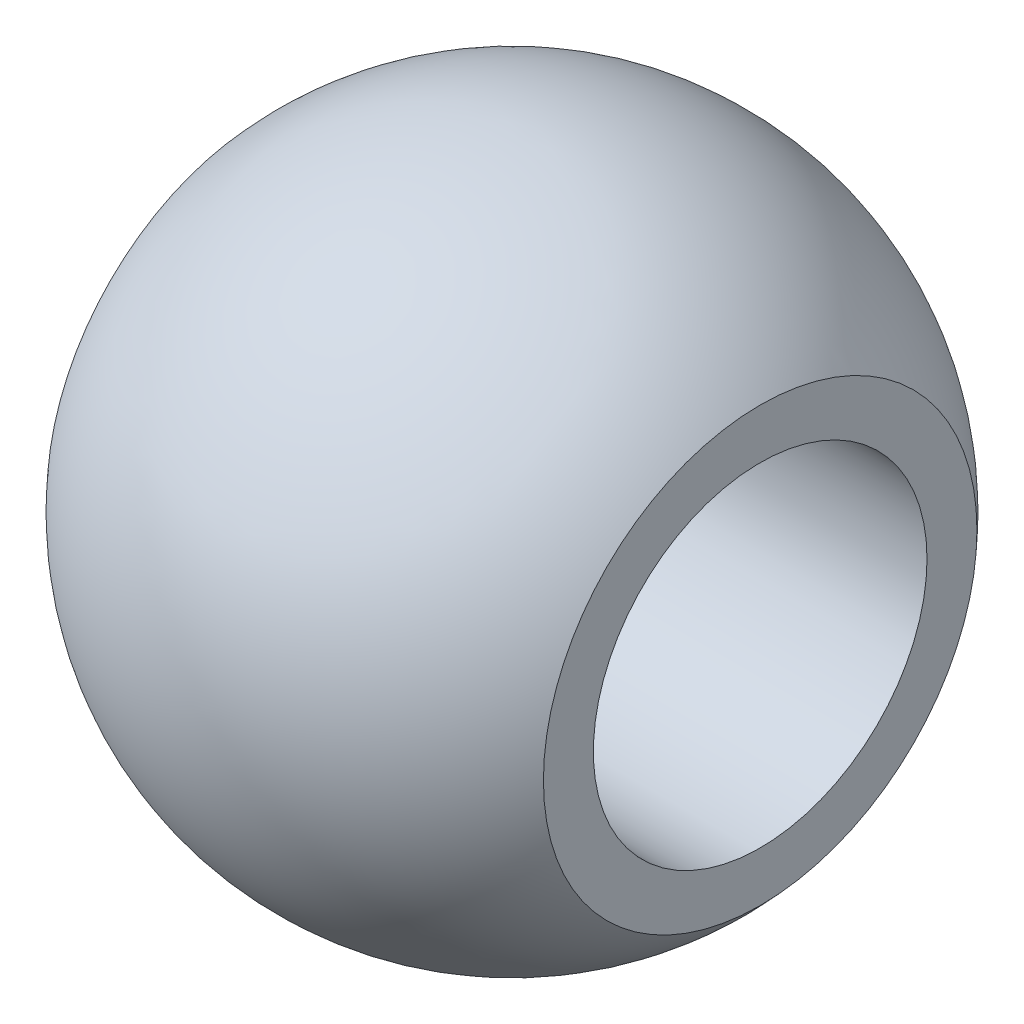
ISO-10303-21;
HEADER;
FILE_DESCRIPTION(('STEP AP214'),'2;1');
FILE_NAME('part.step','',(''),(''),'','','');
FILE_SCHEMA(('AUTOMOTIVE_DESIGN { 1 0 10303 214 1 1 1 1 }'));
ENDSEC;
DATA;
#1=APPLICATION_CONTEXT('core data for automotive mechanical design processes');
#2=APPLICATION_PROTOCOL_DEFINITION('international standard','automotive_design',2000,#1);
#3=PRODUCT_CONTEXT('',#1,'mechanical');
#4=PRODUCT('Part','Part','',(#3));
#5=PRODUCT_RELATED_PRODUCT_CATEGORY('part','',(#4));
#6=PRODUCT_DEFINITION_FORMATION('','',#4);
#7=PRODUCT_DEFINITION_CONTEXT('part definition',#1,'design');
#8=PRODUCT_DEFINITION('design','',#6,#7);
#9=PRODUCT_DEFINITION_SHAPE('','',#8);
#10=(LENGTH_UNIT() NAMED_UNIT(*) SI_UNIT(.MILLI.,.METRE.));
#11=(NAMED_UNIT(*) PLANE_ANGLE_UNIT() SI_UNIT($,.RADIAN.));
#12=(NAMED_UNIT(*) SI_UNIT($,.STERADIAN.) SOLID_ANGLE_UNIT());
#13=UNCERTAINTY_MEASURE_WITH_UNIT(LENGTH_MEASURE(1.E-05),#10,'distance_accuracy_value','');
#14=(GEOMETRIC_REPRESENTATION_CONTEXT(3) GLOBAL_UNCERTAINTY_ASSIGNED_CONTEXT((#13)) GLOBAL_UNIT_ASSIGNED_CONTEXT((#10,
#11,#12)) REPRESENTATION_CONTEXT('',''));
#15=CARTESIAN_POINT('',(0.,0.,0.));
#16=DIRECTION('',(0.,0.,1.));
#17=DIRECTION('',(1.,0.,0.));
#18=AXIS2_PLACEMENT_3D('',#15,#16,#17);
#19=CARTESIAN_POINT('',(0.,0.,0.));
#20=DIRECTION('',(0.,-1.,0.));
#21=DIRECTION('',(0.,0.,-1.));
#22=AXIS2_PLACEMENT_3D('',#19,#20,#21);
#23=SPHERICAL_SURFACE('',#22,7.9);
#24=CARTESIAN_POINT('',(0.,0.,0.));
#25=DIRECTION('',(1.,0.,0.));
#26=DIRECTION('',(0.,0.,-1.));
#27=AXIS2_PLACEMENT_3D('',#24,#25,#26);
#28=SPHERICAL_SURFACE('',#27,7.9);
#29=CARTESIAN_POINT('',(-5.95,0.,0.));
#30=DIRECTION('',(1.,0.,0.));
#31=DIRECTION('',(0.,0.,-1.));
#32=AXIS2_PLACEMENT_3D('',#29,#30,#31);
#33=CIRCLE('',#32,5.19687406043287);
#34=CARTESIAN_POINT('',(-5.95,0.,-5.19687406043287));
#35=VERTEX_POINT('',#34);
#36=EDGE_CURVE('E44',#35,#35,#33,.T.);
#37=ORIENTED_EDGE('',*,*,#36,.T.);
#38=EDGE_LOOP('',(#37));
#39=FACE_BOUND('',#38,.T.);
#40=CARTESIAN_POINT('',(5.95,0.,0.));
#41=DIRECTION('',(1.,0.,0.));
#42=DIRECTION('',(0.,0.,-1.));
#43=AXIS2_PLACEMENT_3D('',#40,#41,#42);
#44=CIRCLE('',#43,5.19687406043287);
#45=CARTESIAN_POINT('',(5.95,0.,-5.19687406043287));
#46=VERTEX_POINT('',#45);
#47=EDGE_CURVE('E11',#46,#46,#44,.T.);
#48=ORIENTED_EDGE('',*,*,#47,.F.);
#49=EDGE_LOOP('',(#48));
#50=FACE_BOUND('',#49,.T.);
#51=ADVANCED_FACE('F41',(#39,#50),#28,.T.);
#52=CARTESIAN_POINT('',(5.95,0.,0.));
#53=DIRECTION('',(1.,0.,0.));
#54=DIRECTION('',(0.,0.,-1.));
#55=AXIS2_PLACEMENT_3D('',#52,#53,#54);
#56=PLANE('',#55);
#57=CARTESIAN_POINT('',(5.95,0.,0.));
#58=DIRECTION('',(1.,0.,0.));
#59=DIRECTION('',(0.,0.,-1.));
#60=AXIS2_PLACEMENT_3D('',#57,#58,#59);
#61=CIRCLE('',#60,4.);
#62=CARTESIAN_POINT('',(5.95,0.,-4.));
#63=VERTEX_POINT('',#62);
#64=EDGE_CURVE('E51',#63,#63,#61,.T.);
#65=ORIENTED_EDGE('',*,*,#64,.F.);
#66=EDGE_LOOP('',(#65));
#67=FACE_BOUND('',#66,.T.);
#68=ORIENTED_EDGE('',*,*,#47,.T.);
#69=EDGE_LOOP('',(#68));
#70=FACE_BOUND('',#69,.T.);
#71=ADVANCED_FACE('F69',(#67,#70),#56,.T.);
#72=CARTESIAN_POINT('',(-5.95,0.,0.));
#73=DIRECTION('',(1.,0.,0.));
#74=DIRECTION('',(0.,0.,-1.));
#75=AXIS2_PLACEMENT_3D('',#72,#73,#74);
#76=PLANE('',#75);
#77=CARTESIAN_POINT('',(-5.95,0.,0.));
#78=DIRECTION('',(1.,0.,0.));
#79=DIRECTION('',(0.,0.,-1.));
#80=AXIS2_PLACEMENT_3D('',#77,#78,#79);
#81=CIRCLE('',#80,4.);
#82=CARTESIAN_POINT('',(-5.95,0.,-4.));
#83=VERTEX_POINT('',#82);
#84=EDGE_CURVE('E55',#83,#83,#81,.T.);
#85=ORIENTED_EDGE('',*,*,#84,.T.);
#86=EDGE_LOOP('',(#85));
#87=FACE_BOUND('',#86,.T.);
#88=ORIENTED_EDGE('',*,*,#36,.F.);
#89=EDGE_LOOP('',(#88));
#90=FACE_BOUND('',#89,.T.);
#91=ADVANCED_FACE('F59',(#87,#90),#76,.F.);
#92=CARTESIAN_POINT('',(5.951,0.,0.));
#93=DIRECTION('',(-1.,0.,0.));
#94=DIRECTION('',(0.,0.,1.));
#95=AXIS2_PLACEMENT_3D('',#92,#93,#94);
#96=CYLINDRICAL_SURFACE('',#95,4.);
#97=ORIENTED_EDGE('',*,*,#64,.T.);
#98=EDGE_LOOP('',(#97));
#99=FACE_BOUND('',#98,.T.);
#100=ORIENTED_EDGE('',*,*,#84,.F.);
#101=EDGE_LOOP('',(#100));
#102=FACE_BOUND('',#101,.T.);
#103=ADVANCED_FACE('F62',(#99,#102),#96,.F.);
#104=CLOSED_SHELL('',(#51,#71,#91,#103));
#105=MANIFOLD_SOLID_BREP('B2',#104);
#106=ADVANCED_BREP_SHAPE_REPRESENTATION('',(#18,#105),#14);
#107=SHAPE_DEFINITION_REPRESENTATION(#9,#106);
ENDSEC;
END-ISO-10303-21;
